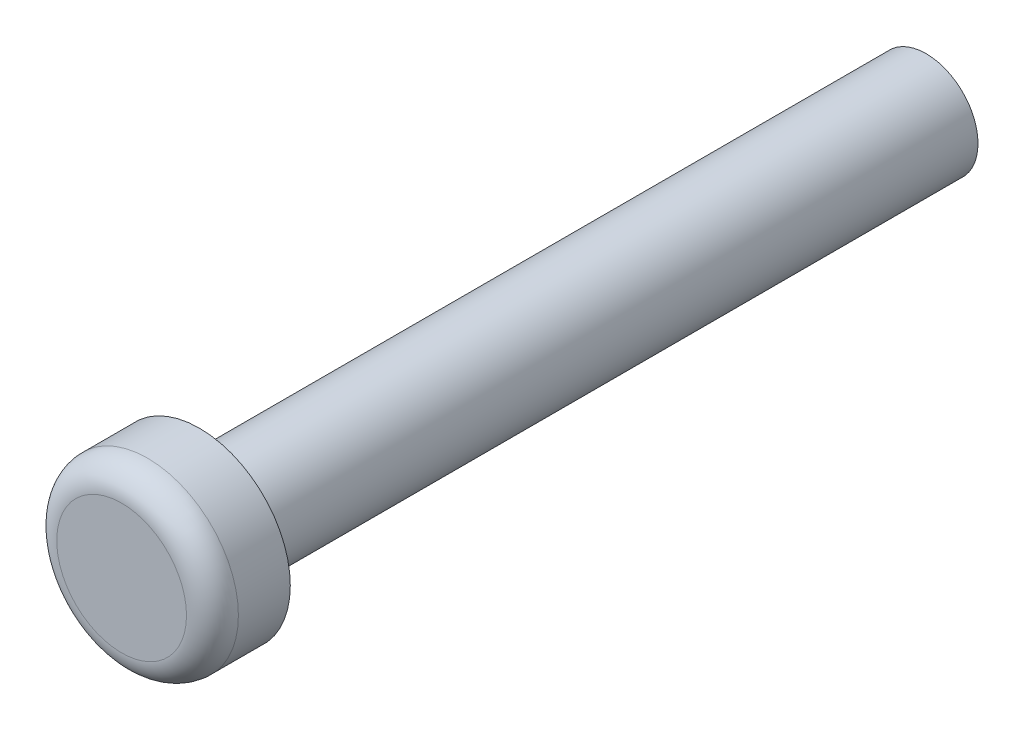
ISO-10303-21;
HEADER;
FILE_DESCRIPTION(('STEP AP214'),'2;1');
FILE_NAME('part.step','',(''),(''),'','','');
FILE_SCHEMA(('AUTOMOTIVE_DESIGN { 1 0 10303 214 1 1 1 1 }'));
ENDSEC;
DATA;
#1=APPLICATION_CONTEXT('core data for automotive mechanical design processes');
#2=APPLICATION_PROTOCOL_DEFINITION('international standard','automotive_design',2000,#1);
#3=PRODUCT_CONTEXT('',#1,'mechanical');
#4=PRODUCT('Part','Part','',(#3));
#5=PRODUCT_RELATED_PRODUCT_CATEGORY('part','',(#4));
#6=PRODUCT_DEFINITION_FORMATION('','',#4);
#7=PRODUCT_DEFINITION_CONTEXT('part definition',#1,'design');
#8=PRODUCT_DEFINITION('design','',#6,#7);
#9=PRODUCT_DEFINITION_SHAPE('','',#8);
#10=(LENGTH_UNIT() NAMED_UNIT(*) SI_UNIT(.MILLI.,.METRE.));
#11=(NAMED_UNIT(*) PLANE_ANGLE_UNIT() SI_UNIT($,.RADIAN.));
#12=(NAMED_UNIT(*) SI_UNIT($,.STERADIAN.) SOLID_ANGLE_UNIT());
#13=UNCERTAINTY_MEASURE_WITH_UNIT(LENGTH_MEASURE(1.E-05),#10,'distance_accuracy_value','');
#14=(GEOMETRIC_REPRESENTATION_CONTEXT(3) GLOBAL_UNCERTAINTY_ASSIGNED_CONTEXT((#13)) GLOBAL_UNIT_ASSIGNED_CONTEXT((#10,
#11,#12)) REPRESENTATION_CONTEXT('',''));
#15=CARTESIAN_POINT('',(0.,0.,0.));
#16=DIRECTION('',(0.,0.,1.));
#17=DIRECTION('',(1.,0.,0.));
#18=AXIS2_PLACEMENT_3D('',#15,#16,#17);
#19=CARTESIAN_POINT('',(0.,0.,0.));
#20=DIRECTION('',(0.,0.,1.));
#21=DIRECTION('',(1.,0.,0.));
#22=AXIS2_PLACEMENT_3D('',#19,#20,#21);
#23=PLANE('',#22);
#24=CARTESIAN_POINT('',(0.,0.,0.));
#25=DIRECTION('',(0.,0.,1.));
#26=DIRECTION('',(1.,0.,0.));
#27=AXIS2_PLACEMENT_3D('',#24,#25,#26);
#28=CIRCLE('',#27,4.445);
#29=CARTESIAN_POINT('',(-4.445,0.,0.));
#30=VERTEX_POINT('',#29);
#31=EDGE_CURVE('E45',#30,#30,#28,.T.);
#32=ORIENTED_EDGE('',*,*,#31,.F.);
#33=EDGE_LOOP('',(#32));
#34=FACE_BOUND('',#33,.T.);
#35=CARTESIAN_POINT('',(0.,0.,0.));
#36=DIRECTION('',(0.,0.,1.));
#37=DIRECTION('',(1.,0.,0.));
#38=AXIS2_PLACEMENT_3D('',#35,#36,#37);
#39=CIRCLE('',#38,2.54);
#40=CARTESIAN_POINT('',(2.54,0.,0.));
#41=VERTEX_POINT('',#40);
#42=EDGE_CURVE('E10',#41,#41,#39,.F.);
#43=ORIENTED_EDGE('',*,*,#42,.F.);
#44=EDGE_LOOP('',(#43));
#45=FACE_BOUND('',#44,.T.);
#46=ADVANCED_FACE('F30',(#34,#45),#23,.F.);
#47=CARTESIAN_POINT('',(0.,0.,3.81));
#48=DIRECTION('',(0.,0.,-1.));
#49=DIRECTION('',(-1.,0.,0.));
#50=AXIS2_PLACEMENT_3D('',#47,#48,#49);
#51=CYLINDRICAL_SURFACE('',#50,4.445);
#52=CARTESIAN_POINT('',(0.,0.,2.54));
#53=DIRECTION('',(0.,0.,1.));
#54=DIRECTION('',(1.,0.,0.));
#55=AXIS2_PLACEMENT_3D('',#52,#53,#54);
#56=CIRCLE('',#55,4.445);
#57=CARTESIAN_POINT('',(-4.445,0.,2.54));
#58=VERTEX_POINT('',#57);
#59=EDGE_CURVE('E37',#58,#58,#56,.F.);
#60=CARTESIAN_POINT('',(-4.445,0.,2.54));
#61=CARTESIAN_POINT('',(-4.445,0.,2.51354166666667));
#62=CARTESIAN_POINT('',(-4.445,0.,2.48708333333333));
#63=CARTESIAN_POINT('',(-4.445,0.,2.43416666666667));
#64=CARTESIAN_POINT('',(-4.445,0.,2.40770833333333));
#65=CARTESIAN_POINT('',(-4.445,0.,2.35479166666667));
#66=CARTESIAN_POINT('',(-4.445,0.,2.32833333333333));
#67=CARTESIAN_POINT('',(-4.445,0.,2.27541666666667));
#68=CARTESIAN_POINT('',(-4.445,0.,2.24895833333333));
#69=CARTESIAN_POINT('',(-4.445,0.,2.19604166666667));
#70=CARTESIAN_POINT('',(-4.445,0.,2.16958333333333));
#71=CARTESIAN_POINT('',(-4.445,0.,2.11666666666667));
#72=CARTESIAN_POINT('',(-4.445,0.,2.09020833333333));
#73=CARTESIAN_POINT('',(-4.445,0.,2.03729166666667));
#74=CARTESIAN_POINT('',(-4.445,0.,2.01083333333333));
#75=CARTESIAN_POINT('',(-4.445,0.,1.95791666666667));
#76=CARTESIAN_POINT('',(-4.445,0.,1.93145833333333));
#77=CARTESIAN_POINT('',(-4.445,0.,1.87854166666667));
#78=CARTESIAN_POINT('',(-4.445,0.,1.85208333333333));
#79=CARTESIAN_POINT('',(-4.445,0.,1.79916666666667));
#80=CARTESIAN_POINT('',(-4.445,0.,1.77270833333333));
#81=CARTESIAN_POINT('',(-4.445,0.,1.71979166666667));
#82=CARTESIAN_POINT('',(-4.445,0.,1.69333333333333));
#83=CARTESIAN_POINT('',(-4.445,0.,1.64041666666667));
#84=CARTESIAN_POINT('',(-4.445,0.,1.61395833333333));
#85=CARTESIAN_POINT('',(-4.445,0.,1.56104166666667));
#86=CARTESIAN_POINT('',(-4.445,0.,1.53458333333333));
#87=CARTESIAN_POINT('',(-4.445,0.,1.48166666666667));
#88=CARTESIAN_POINT('',(-4.445,0.,1.45520833333333));
#89=CARTESIAN_POINT('',(-4.445,0.,1.40229166666667));
#90=CARTESIAN_POINT('',(-4.445,0.,1.37583333333333));
#91=CARTESIAN_POINT('',(-4.445,0.,1.32291666666667));
#92=CARTESIAN_POINT('',(-4.445,0.,1.29645833333333));
#93=CARTESIAN_POINT('',(-4.445,0.,1.24354166666667));
#94=CARTESIAN_POINT('',(-4.445,0.,1.21708333333333));
#95=CARTESIAN_POINT('',(-4.445,0.,1.16416666666667));
#96=CARTESIAN_POINT('',(-4.445,0.,1.13770833333333));
#97=CARTESIAN_POINT('',(-4.445,0.,1.08479166666667));
#98=CARTESIAN_POINT('',(-4.445,0.,1.05833333333333));
#99=CARTESIAN_POINT('',(-4.445,0.,1.00541666666667));
#100=CARTESIAN_POINT('',(-4.445,0.,0.978958333333333));
#101=CARTESIAN_POINT('',(-4.445,0.,0.926041666666666));
#102=CARTESIAN_POINT('',(-4.445,0.,0.899583333333333));
#103=CARTESIAN_POINT('',(-4.445,0.,0.846666666666667));
#104=CARTESIAN_POINT('',(-4.445,0.,0.820208333333333));
#105=CARTESIAN_POINT('',(-4.445,0.,0.767291666666667));
#106=CARTESIAN_POINT('',(-4.445,0.,0.740833333333333));
#107=CARTESIAN_POINT('',(-4.445,0.,0.687916666666667));
#108=CARTESIAN_POINT('',(-4.445,0.,0.661458333333333));
#109=CARTESIAN_POINT('',(-4.445,0.,0.608541666666667));
#110=CARTESIAN_POINT('',(-4.445,0.,0.582083333333333));
#111=CARTESIAN_POINT('',(-4.445,0.,0.529166666666667));
#112=CARTESIAN_POINT('',(-4.445,0.,0.502708333333333));
#113=CARTESIAN_POINT('',(-4.445,0.,0.449791666666667));
#114=CARTESIAN_POINT('',(-4.445,0.,0.423333333333333));
#115=CARTESIAN_POINT('',(-4.445,0.,0.370416666666667));
#116=CARTESIAN_POINT('',(-4.445,0.,0.343958333333333));
#117=CARTESIAN_POINT('',(-4.445,0.,0.291041666666667));
#118=CARTESIAN_POINT('',(-4.445,0.,0.264583333333333));
#119=CARTESIAN_POINT('',(-4.445,0.,0.211666666666667));
#120=CARTESIAN_POINT('',(-4.445,0.,0.185208333333333));
#121=CARTESIAN_POINT('',(-4.445,0.,0.132291666666667));
#122=CARTESIAN_POINT('',(-4.445,0.,0.105833333333333));
#123=CARTESIAN_POINT('',(-4.445,0.,0.0529166666666667));
#124=CARTESIAN_POINT('',(-4.445,0.,0.0264583333333333));
#125=CARTESIAN_POINT('',(-4.445,0.,0.));
#126=B_SPLINE_CURVE_WITH_KNOTS('',3,(#60,#61,#62,#63,#64,#65,#66,#67,#68,#69,#70,#71,#72,#73,
#74,#75,#76,#77,#78,#79,#80,#81,#82,#83,#84,#85,#86,#87,#88,#89,#90,#91,#92,#93,#94,#95,#96,#97,
#98,#99,#100,#101,#102,#103,#104,#105,#106,#107,#108,#109,#110,#111,#112,#113,#114,#115,#116,
#117,#118,#119,#120,#121,#122,#123,#124,#125),.UNSPECIFIED.,.F.,.F.,(4,2,2,2,2,2,2,2,2,2,2,2,2,
2,2,2,2,2,2,2,2,2,2,2,2,2,2,2,2,2,2,2,4),(0.,0.0793750000000004,0.15875,0.238125,0.3175,
0.396875000000001,0.47625,0.555625,0.635,0.714375,0.79375,0.873125,0.9525,1.031875,1.11125,
1.190625,1.27,1.349375,1.42875,1.508125,1.5875,1.666875,1.74625,1.825625,1.905,1.984375,2.06375,
2.143125,2.2225,2.301875,2.38125,2.460625,2.54),.UNSPECIFIED.);
#127=EDGE_CURVE('BSEAM68',#58,#30,#126,.T.);
#128=ORIENTED_EDGE('',*,*,#59,.T.);
#129=ORIENTED_EDGE('',*,*,#31,.T.);
#130=ORIENTED_EDGE('',*,*,#127,.T.);
#131=ORIENTED_EDGE('',*,*,#127,.F.);
#132=EDGE_LOOP('',(#128,#130,#129,#131));
#133=FACE_BOUND('',#132,.T.);
#134=ADVANCED_FACE('F68',(#133),#51,.T.);
#135=CARTESIAN_POINT('',(0.,0.,3.81));
#136=DIRECTION('',(0.,0.,1.));
#137=DIRECTION('',(1.,0.,0.));
#138=AXIS2_PLACEMENT_3D('',#135,#136,#137);
#139=PLANE('',#138);
#140=CARTESIAN_POINT('',(0.,0.,3.81));
#141=DIRECTION('',(0.,0.,1.));
#142=DIRECTION('',(1.,0.,0.));
#143=AXIS2_PLACEMENT_3D('',#140,#141,#142);
#144=CIRCLE('',#143,3.175);
#145=CARTESIAN_POINT('',(3.175,0.,3.81));
#146=VERTEX_POINT('',#145);
#147=EDGE_CURVE('E41',#146,#146,#144,.T.);
#148=ORIENTED_EDGE('',*,*,#147,.T.);
#149=EDGE_LOOP('',(#148));
#150=FACE_BOUND('',#149,.T.);
#151=ADVANCED_FACE('F64',(#150),#139,.T.);
#152=CARTESIAN_POINT('',(0.,0.,2.54));
#153=DIRECTION('',(0.,0.,1.));
#154=DIRECTION('',(1.,0.,0.));
#155=AXIS2_PLACEMENT_3D('',#152,#153,#154);
#156=TOROIDAL_SURFACE('',#155,3.175,1.27);
#157=ORIENTED_EDGE('',*,*,#59,.F.);
#158=EDGE_LOOP('',(#157));
#159=FACE_BOUND('',#158,.T.);
#160=ORIENTED_EDGE('',*,*,#147,.F.);
#161=EDGE_LOOP('',(#160));
#162=FACE_BOUND('',#161,.T.);
#163=ADVANCED_FACE('F32',(#159,#162),#156,.T.);
#164=CARTESIAN_POINT('',(0.,0.,-35.56));
#165=DIRECTION('',(0.,0.,1.));
#166=DIRECTION('',(1.,0.,0.));
#167=AXIS2_PLACEMENT_3D('',#164,#165,#166);
#168=CYLINDRICAL_SURFACE('',#167,2.54);
#169=CARTESIAN_POINT('',(0.,0.,-35.56));
#170=DIRECTION('',(0.,0.,-1.));
#171=DIRECTION('',(-1.,0.,0.));
#172=AXIS2_PLACEMENT_3D('',#169,#170,#171);
#173=CIRCLE('',#172,2.54);
#174=CARTESIAN_POINT('',(-2.54,0.,-35.56));
#175=VERTEX_POINT('',#174);
#176=EDGE_CURVE('E50',#175,#175,#173,.T.);
#177=ORIENTED_EDGE('',*,*,#176,.F.);
#178=EDGE_LOOP('',(#177));
#179=FACE_BOUND('',#178,.T.);
#180=ORIENTED_EDGE('',*,*,#42,.T.);
#181=EDGE_LOOP('',(#180));
#182=FACE_BOUND('',#181,.T.);
#183=ADVANCED_FACE('F56',(#179,#182),#168,.T.);
#184=CARTESIAN_POINT('',(0.,0.,-35.56));
#185=DIRECTION('',(0.,0.,-1.));
#186=DIRECTION('',(-1.,0.,0.));
#187=AXIS2_PLACEMENT_3D('',#184,#185,#186);
#188=PLANE('',#187);
#189=ORIENTED_EDGE('',*,*,#176,.T.);
#190=EDGE_LOOP('',(#189));
#191=FACE_BOUND('',#190,.T.);
#192=ADVANCED_FACE('F54',(#191),#188,.T.);
#193=CLOSED_SHELL('',(#46,#134,#151,#163,#183,#192));
#194=MANIFOLD_SOLID_BREP('B2',#193);
#195=ADVANCED_BREP_SHAPE_REPRESENTATION('',(#18,#194),#14);
#196=SHAPE_DEFINITION_REPRESENTATION(#9,#195);
ENDSEC;
END-ISO-10303-21;
